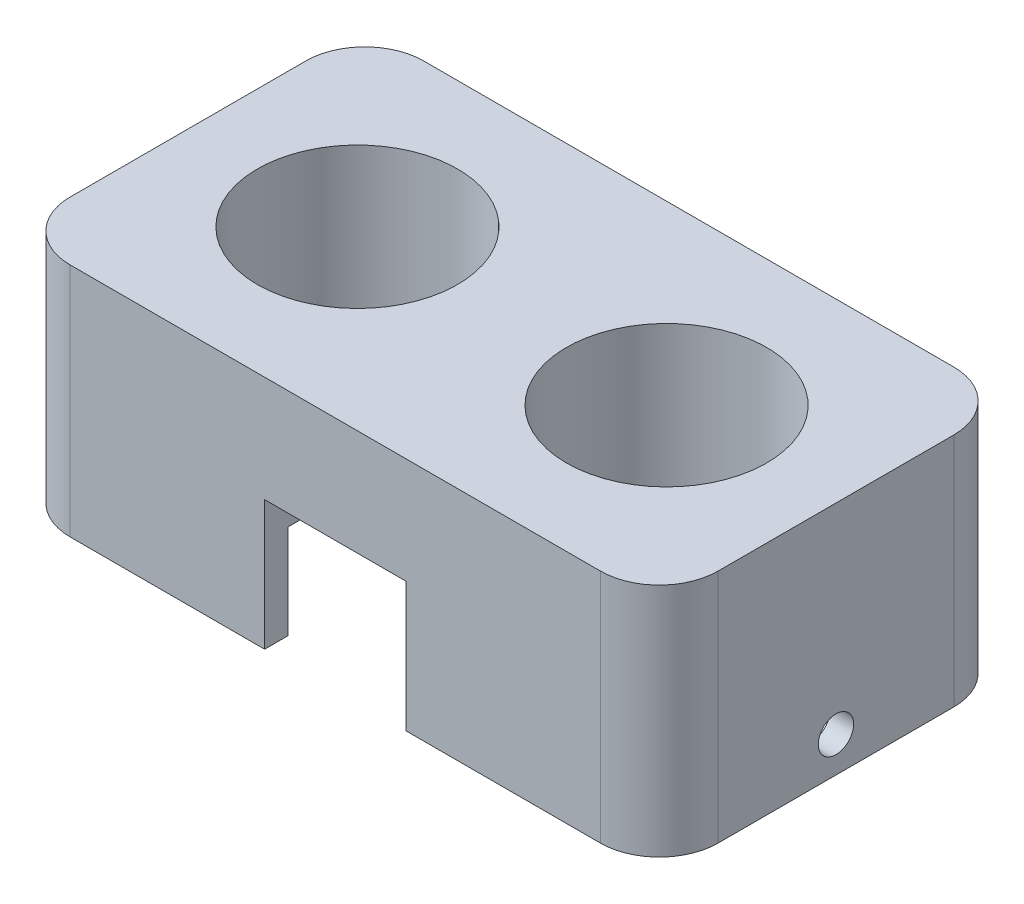
ISO-10303-21;
HEADER;
FILE_DESCRIPTION(('STEP AP214'),'2;1');
FILE_NAME('part.step','',(''),(''),'','','');
FILE_SCHEMA(('AUTOMOTIVE_DESIGN { 1 0 10303 214 1 1 1 1 }'));
ENDSEC;
DATA;
#1=APPLICATION_CONTEXT('core data for automotive mechanical design processes');
#2=APPLICATION_PROTOCOL_DEFINITION('international standard','automotive_design',2000,#1);
#3=PRODUCT_CONTEXT('',#1,'mechanical');
#4=PRODUCT('Part','Part','',(#3));
#5=PRODUCT_RELATED_PRODUCT_CATEGORY('part','',(#4));
#6=PRODUCT_DEFINITION_FORMATION('','',#4);
#7=PRODUCT_DEFINITION_CONTEXT('part definition',#1,'design');
#8=PRODUCT_DEFINITION('design','',#6,#7);
#9=PRODUCT_DEFINITION_SHAPE('','',#8);
#10=(LENGTH_UNIT() NAMED_UNIT(*) SI_UNIT(.MILLI.,.METRE.));
#11=(NAMED_UNIT(*) PLANE_ANGLE_UNIT() SI_UNIT($,.RADIAN.));
#12=(NAMED_UNIT(*) SI_UNIT($,.STERADIAN.) SOLID_ANGLE_UNIT());
#13=UNCERTAINTY_MEASURE_WITH_UNIT(LENGTH_MEASURE(1.E-05),#10,'distance_accuracy_value','');
#14=(GEOMETRIC_REPRESENTATION_CONTEXT(3) GLOBAL_UNCERTAINTY_ASSIGNED_CONTEXT((#13)) GLOBAL_UNIT_ASSIGNED_CONTEXT((#10,
#11,#12)) REPRESENTATION_CONTEXT('',''));
#15=CARTESIAN_POINT('',(0.,0.,0.));
#16=DIRECTION('',(0.,0.,1.));
#17=DIRECTION('',(1.,0.,0.));
#18=AXIS2_PLACEMENT_3D('',#15,#16,#17);
#19=CARTESIAN_POINT('',(0.,0.,0.));
#20=DIRECTION('',(0.,-1.,0.));
#21=DIRECTION('',(0.,0.,-1.));
#22=AXIS2_PLACEMENT_3D('',#19,#20,#21);
#23=PLANE('',#22);
#24=DIRECTION('',(0.,0.,-1.));
#25=VECTOR('',#24,1.);
#26=CARTESIAN_POINT('',(-6.,0.,-12.5));
#27=LINE('',#26,#25);
#28=CARTESIAN_POINT('',(-6.,0.,-9.5));
#29=VERTEX_POINT('',#28);
#30=CARTESIAN_POINT('',(-6.,0.,-10.5));
#31=VERTEX_POINT('',#30);
#32=EDGE_CURVE('E370',#29,#31,#27,.T.);
#33=ORIENTED_EDGE('',*,*,#32,.F.);
#34=CARTESIAN_POINT('',(-4.,0.,-9.5));
#35=DIRECTION('',(0.,-1.,0.));
#36=DIRECTION('',(0.,0.,-1.));
#37=AXIS2_PLACEMENT_3D('',#34,#35,#36);
#38=CIRCLE('',#37,2.);
#39=CARTESIAN_POINT('',(-4.,0.,-7.5));
#40=VERTEX_POINT('',#39);
#41=EDGE_CURVE('E453',#29,#40,#38,.F.);
#42=ORIENTED_EDGE('',*,*,#41,.T.);
#43=DIRECTION('',(-1.,0.,0.));
#44=VECTOR('',#43,1.);
#45=CARTESIAN_POINT('',(6.,0.,-7.5));
#46=LINE('',#45,#44);
#47=CARTESIAN_POINT('',(4.,0.,-7.5));
#48=VERTEX_POINT('',#47);
#49=EDGE_CURVE('E381',#48,#40,#46,.T.);
#50=ORIENTED_EDGE('',*,*,#49,.F.);
#51=CARTESIAN_POINT('',(4.,0.,-9.49999999999999));
#52=DIRECTION('',(0.,-1.,0.));
#53=DIRECTION('',(0.,0.,-1.));
#54=AXIS2_PLACEMENT_3D('',#51,#52,#53);
#55=CIRCLE('',#54,2.);
#56=CARTESIAN_POINT('',(6.,0.,-9.49999999999999));
#57=VERTEX_POINT('',#56);
#58=EDGE_CURVE('E451',#48,#57,#55,.F.);
#59=ORIENTED_EDGE('',*,*,#58,.T.);
#60=DIRECTION('',(0.,0.,1.));
#61=VECTOR('',#60,1.);
#62=CARTESIAN_POINT('',(6.,0.,-12.5));
#63=LINE('',#62,#61);
#64=CARTESIAN_POINT('',(6.,0.,-10.5));
#65=VERTEX_POINT('',#64);
#66=EDGE_CURVE('E396',#65,#57,#63,.T.);
#67=ORIENTED_EDGE('',*,*,#66,.F.);
#68=CARTESIAN_POINT('',(4.,0.,-10.5));
#69=DIRECTION('',(0.,-1.,0.));
#70=DIRECTION('',(0.,0.,-1.));
#71=AXIS2_PLACEMENT_3D('',#68,#69,#70);
#72=CIRCLE('',#71,2.);
#73=CARTESIAN_POINT('',(4.,0.,-12.5));
#74=VERTEX_POINT('',#73);
#75=EDGE_CURVE('E457',#65,#74,#72,.F.);
#76=ORIENTED_EDGE('',*,*,#75,.T.);
#77=DIRECTION('',(1.,0.,0.));
#78=VECTOR('',#77,1.);
#79=CARTESIAN_POINT('',(6.,0.,-12.5));
#80=LINE('',#79,#78);
#81=CARTESIAN_POINT('',(-4.,0.,-12.5));
#82=VERTEX_POINT('',#81);
#83=EDGE_CURVE('E393',#82,#74,#80,.T.);
#84=ORIENTED_EDGE('',*,*,#83,.F.);
#85=CARTESIAN_POINT('',(-4.,0.,-10.5));
#86=DIRECTION('',(0.,-1.,0.));
#87=DIRECTION('',(0.,0.,-1.));
#88=AXIS2_PLACEMENT_3D('',#85,#86,#87);
#89=CIRCLE('',#88,2.);
#90=EDGE_CURVE('E455',#82,#31,#89,.F.);
#91=ORIENTED_EDGE('',*,*,#90,.T.);
#92=EDGE_LOOP('',(#33,#42,#50,#59,#67,#76,#84,#91));
#93=FACE_BOUND('',#92,.T.);
#94=CARTESIAN_POINT('',(13.12,0.,0.));
#95=DIRECTION('',(0.,1.,0.));
#96=DIRECTION('',(0.,0.,1.));
#97=AXIS2_PLACEMENT_3D('',#94,#95,#96);
#98=CIRCLE('',#97,8.5);
#99=CARTESIAN_POINT('',(13.12,0.,8.5));
#100=VERTEX_POINT('',#99);
#101=EDGE_CURVE('E408',#100,#100,#98,.F.);
#102=ORIENTED_EDGE('',*,*,#101,.F.);
#103=EDGE_LOOP('',(#102));
#104=FACE_BOUND('',#103,.T.);
#105=CARTESIAN_POINT('',(-13.12,0.,0.));
#106=DIRECTION('',(0.,1.,0.));
#107=DIRECTION('',(0.,0.,1.));
#108=AXIS2_PLACEMENT_3D('',#105,#106,#107);
#109=CIRCLE('',#108,8.5);
#110=CARTESIAN_POINT('',(-13.12,0.,8.5));
#111=VERTEX_POINT('',#110);
#112=EDGE_CURVE('E401',#111,#111,#109,.T.);
#113=ORIENTED_EDGE('',*,*,#112,.T.);
#114=EDGE_LOOP('',(#113));
#115=FACE_BOUND('',#114,.T.);
#116=CARTESIAN_POINT('',(22.5,0.,10.));
#117=DIRECTION('',(0.,-1.,0.));
#118=DIRECTION('',(0.,0.,-1.));
#119=AXIS2_PLACEMENT_3D('',#116,#117,#118);
#120=CIRCLE('',#119,3.);
#121=CARTESIAN_POINT('',(25.5,0.,10.));
#122=VERTEX_POINT('',#121);
#123=CARTESIAN_POINT('',(22.5,0.,13.));
#124=VERTEX_POINT('',#123);
#125=EDGE_CURVE('E328',#122,#124,#120,.T.);
#126=ORIENTED_EDGE('',*,*,#125,.T.);
#127=DIRECTION('',(-1.,0.,0.));
#128=VECTOR('',#127,1.);
#129=CARTESIAN_POINT('',(0.,0.,13.));
#130=LINE('',#129,#128);
#131=CARTESIAN_POINT('',(6.,0.,13.));
#132=VERTEX_POINT('',#131);
#133=EDGE_CURVE('E325',#124,#132,#130,.T.);
#134=ORIENTED_EDGE('',*,*,#133,.T.);
#135=DIRECTION('',(0.,0.,1.));
#136=VECTOR('',#135,1.);
#137=CARTESIAN_POINT('',(6.,0.,10.));
#138=LINE('',#137,#136);
#139=CARTESIAN_POINT('',(6.,0.,10.));
#140=VERTEX_POINT('',#139);
#141=EDGE_CURVE('E240',#140,#132,#138,.T.);
#142=ORIENTED_EDGE('',*,*,#141,.F.);
#143=DIRECTION('',(1.,0.,0.));
#144=VECTOR('',#143,1.);
#145=CARTESIAN_POINT('',(-6.,0.,10.));
#146=LINE('',#145,#144);
#147=CARTESIAN_POINT('',(-6.,0.,10.));
#148=VERTEX_POINT('',#147);
#149=EDGE_CURVE('E352',#148,#140,#146,.T.);
#150=ORIENTED_EDGE('',*,*,#149,.F.);
#151=DIRECTION('',(0.,0.,-1.));
#152=VECTOR('',#151,1.);
#153=CARTESIAN_POINT('',(-6.,0.,10.));
#154=LINE('',#153,#152);
#155=CARTESIAN_POINT('',(-6.,0.,13.));
#156=VERTEX_POINT('',#155);
#157=EDGE_CURVE('E364',#156,#148,#154,.T.);
#158=ORIENTED_EDGE('',*,*,#157,.F.);
#159=DIRECTION('',(-1.,0.,0.));
#160=VECTOR('',#159,1.);
#161=CARTESIAN_POINT('',(0.,0.,13.));
#162=LINE('',#161,#160);
#163=CARTESIAN_POINT('',(-22.5,0.,13.));
#164=VERTEX_POINT('',#163);
#165=EDGE_CURVE('E322',#156,#164,#162,.T.);
#166=ORIENTED_EDGE('',*,*,#165,.T.);
#167=CARTESIAN_POINT('',(-22.5,0.,10.));
#168=DIRECTION('',(0.,-1.,0.));
#169=DIRECTION('',(0.,0.,-1.));
#170=AXIS2_PLACEMENT_3D('',#167,#168,#169);
#171=CIRCLE('',#170,3.);
#172=CARTESIAN_POINT('',(-25.5,0.,10.));
#173=VERTEX_POINT('',#172);
#174=EDGE_CURVE('E319',#164,#173,#171,.T.);
#175=ORIENTED_EDGE('',*,*,#174,.T.);
#176=DIRECTION('',(0.,0.,-1.));
#177=VECTOR('',#176,1.);
#178=CARTESIAN_POINT('',(-25.5,0.,0.));
#179=LINE('',#178,#177);
#180=CARTESIAN_POINT('',(-25.5,0.,-10.));
#181=VERTEX_POINT('',#180);
#182=EDGE_CURVE('E316',#173,#181,#179,.T.);
#183=ORIENTED_EDGE('',*,*,#182,.T.);
#184=CARTESIAN_POINT('',(-22.5,0.,-10.));
#185=DIRECTION('',(0.,-1.,0.));
#186=DIRECTION('',(0.,0.,-1.));
#187=AXIS2_PLACEMENT_3D('',#184,#185,#186);
#188=CIRCLE('',#187,3.);
#189=CARTESIAN_POINT('',(-22.5,0.,-13.));
#190=VERTEX_POINT('',#189);
#191=EDGE_CURVE('E313',#181,#190,#188,.T.);
#192=ORIENTED_EDGE('',*,*,#191,.T.);
#193=DIRECTION('',(1.,0.,0.));
#194=VECTOR('',#193,1.);
#195=CARTESIAN_POINT('',(0.,0.,-13.));
#196=LINE('',#195,#194);
#197=CARTESIAN_POINT('',(22.5,0.,-13.));
#198=VERTEX_POINT('',#197);
#199=EDGE_CURVE('E310',#190,#198,#196,.T.);
#200=ORIENTED_EDGE('',*,*,#199,.T.);
#201=CARTESIAN_POINT('',(22.5,0.,-10.));
#202=DIRECTION('',(0.,-1.,0.));
#203=DIRECTION('',(0.,0.,-1.));
#204=AXIS2_PLACEMENT_3D('',#201,#202,#203);
#205=CIRCLE('',#204,3.);
#206=CARTESIAN_POINT('',(25.5,0.,-10.));
#207=VERTEX_POINT('',#206);
#208=EDGE_CURVE('E51',#198,#207,#205,.T.);
#209=ORIENTED_EDGE('',*,*,#208,.T.);
#210=DIRECTION('',(0.,0.,1.));
#211=VECTOR('',#210,1.);
#212=CARTESIAN_POINT('',(25.5,0.,0.));
#213=LINE('',#212,#211);
#214=EDGE_CURVE('E252',#207,#122,#213,.T.);
#215=ORIENTED_EDGE('',*,*,#214,.T.);
#216=EDGE_LOOP('',(#126,#134,#142,#150,#158,#166,#175,#183,#192,#200,#209,#215));
#217=FACE_BOUND('',#216,.T.);
#218=ADVANCED_FACE('F35',(#93,#104,#115,#217),#23,.T.);
#219=CARTESIAN_POINT('',(0.,12.,0.));
#220=DIRECTION('',(0.,-1.,0.));
#221=DIRECTION('',(0.,0.,-1.));
#222=AXIS2_PLACEMENT_3D('',#219,#220,#221);
#223=PLANE('',#222);
#224=DIRECTION('',(1.,0.,0.));
#225=VECTOR('',#224,1.);
#226=CARTESIAN_POINT('',(-27.5,12.,15.));
#227=LINE('',#226,#225);
#228=CARTESIAN_POINT('',(-22.5,12.,15.));
#229=VERTEX_POINT('',#228);
#230=CARTESIAN_POINT('',(22.5,12.,15.));
#231=VERTEX_POINT('',#230);
#232=EDGE_CURVE('E420',#229,#231,#227,.T.);
#233=ORIENTED_EDGE('',*,*,#232,.T.);
#234=CARTESIAN_POINT('',(22.5,12.,10.));
#235=DIRECTION('',(0.,-1.,0.));
#236=DIRECTION('',(0.,0.,-1.));
#237=AXIS2_PLACEMENT_3D('',#234,#235,#236);
#238=CIRCLE('',#237,5.);
#239=CARTESIAN_POINT('',(27.5,12.,10.));
#240=VERTEX_POINT('',#239);
#241=EDGE_CURVE('E473',#231,#240,#238,.F.);
#242=ORIENTED_EDGE('',*,*,#241,.T.);
#243=DIRECTION('',(0.,0.,-1.));
#244=VECTOR('',#243,1.);
#245=CARTESIAN_POINT('',(27.5,12.,15.));
#246=LINE('',#245,#244);
#247=CARTESIAN_POINT('',(27.5,12.,-10.));
#248=VERTEX_POINT('',#247);
#249=EDGE_CURVE('E404',#240,#248,#246,.T.);
#250=ORIENTED_EDGE('',*,*,#249,.T.);
#251=CARTESIAN_POINT('',(22.5,12.,-10.));
#252=DIRECTION('',(0.,-1.,0.));
#253=DIRECTION('',(0.,0.,-1.));
#254=AXIS2_PLACEMENT_3D('',#251,#252,#253);
#255=CIRCLE('',#254,5.);
#256=CARTESIAN_POINT('',(22.5,12.,-15.));
#257=VERTEX_POINT('',#256);
#258=EDGE_CURVE('E469',#248,#257,#255,.F.);
#259=ORIENTED_EDGE('',*,*,#258,.T.);
#260=DIRECTION('',(-1.,0.,0.));
#261=VECTOR('',#260,1.);
#262=CARTESIAN_POINT('',(-27.5,12.,-15.));
#263=LINE('',#262,#261);
#264=CARTESIAN_POINT('',(-22.5,12.,-15.));
#265=VERTEX_POINT('',#264);
#266=EDGE_CURVE('E415',#257,#265,#263,.T.);
#267=ORIENTED_EDGE('',*,*,#266,.T.);
#268=CARTESIAN_POINT('',(-22.5,12.,-10.));
#269=DIRECTION('',(0.,-1.,0.));
#270=DIRECTION('',(0.,0.,-1.));
#271=AXIS2_PLACEMENT_3D('',#268,#269,#270);
#272=CIRCLE('',#271,5.);
#273=CARTESIAN_POINT('',(-27.5,12.,-10.));
#274=VERTEX_POINT('',#273);
#275=EDGE_CURVE('E471',#265,#274,#272,.F.);
#276=ORIENTED_EDGE('',*,*,#275,.T.);
#277=DIRECTION('',(0.,0.,1.));
#278=VECTOR('',#277,1.);
#279=CARTESIAN_POINT('',(-27.5,12.,15.));
#280=LINE('',#279,#278);
#281=CARTESIAN_POINT('',(-27.5,12.,10.));
#282=VERTEX_POINT('',#281);
#283=EDGE_CURVE('E418',#274,#282,#280,.T.);
#284=ORIENTED_EDGE('',*,*,#283,.T.);
#285=CARTESIAN_POINT('',(-22.5,12.,10.));
#286=DIRECTION('',(0.,-1.,0.));
#287=DIRECTION('',(0.,0.,-1.));
#288=AXIS2_PLACEMENT_3D('',#285,#286,#287);
#289=CIRCLE('',#288,5.);
#290=EDGE_CURVE('E467',#282,#229,#289,.F.);
#291=ORIENTED_EDGE('',*,*,#290,.T.);
#292=EDGE_LOOP('',(#233,#242,#250,#259,#267,#276,#284,#291));
#293=FACE_BOUND('',#292,.T.);
#294=CARTESIAN_POINT('',(13.12,12.,0.));
#295=DIRECTION('',(0.,1.,0.));
#296=DIRECTION('',(0.,0.,1.));
#297=AXIS2_PLACEMENT_3D('',#294,#295,#296);
#298=CIRCLE('',#297,8.5);
#299=CARTESIAN_POINT('',(13.12,12.,8.5));
#300=VERTEX_POINT('',#299);
#301=EDGE_CURVE('E390',#300,#300,#298,.F.);
#302=ORIENTED_EDGE('',*,*,#301,.T.);
#303=EDGE_LOOP('',(#302));
#304=FACE_BOUND('',#303,.T.);
#305=CARTESIAN_POINT('',(-13.12,12.,0.));
#306=DIRECTION('',(0.,1.,0.));
#307=DIRECTION('',(0.,0.,1.));
#308=AXIS2_PLACEMENT_3D('',#305,#306,#307);
#309=CIRCLE('',#308,8.5);
#310=CARTESIAN_POINT('',(-13.12,12.,8.5));
#311=VERTEX_POINT('',#310);
#312=EDGE_CURVE('E405',#311,#311,#309,.T.);
#313=ORIENTED_EDGE('',*,*,#312,.F.);
#314=EDGE_LOOP('',(#313));
#315=FACE_BOUND('',#314,.T.);
#316=ADVANCED_FACE('F494',(#293,#304,#315),#223,.F.);
#317=CARTESIAN_POINT('',(27.5,12.,15.));
#318=DIRECTION('',(-1.,0.,0.));
#319=DIRECTION('',(0.,0.,1.));
#320=AXIS2_PLACEMENT_3D('',#317,#318,#319);
#321=PLANE('',#320);
#322=CARTESIAN_POINT('',(27.5,-5.,0.));
#323=DIRECTION('',(-1.,0.,0.));
#324=DIRECTION('',(0.,0.,1.));
#325=AXIS2_PLACEMENT_3D('',#322,#323,#324);
#326=CIRCLE('',#325,1.49999999999999);
#327=CARTESIAN_POINT('',(27.5,-5.,1.49999999999999));
#328=VERTEX_POINT('',#327);
#329=EDGE_CURVE('E925',#328,#328,#326,.T.);
#330=ORIENTED_EDGE('',*,*,#329,.T.);
#331=EDGE_LOOP('',(#330));
#332=FACE_BOUND('',#331,.T.);
#333=ORIENTED_EDGE('',*,*,#249,.F.);
#334=DIRECTION('',(0.,-1.,0.));
#335=VECTOR('',#334,1.);
#336=CARTESIAN_POINT('',(27.5,12.,10.));
#337=LINE('',#336,#335);
#338=CARTESIAN_POINT('',(27.5,-8.,10.));
#339=VERTEX_POINT('',#338);
#340=EDGE_CURVE('E461',#240,#339,#337,.T.);
#341=ORIENTED_EDGE('',*,*,#340,.T.);
#342=DIRECTION('',(0.,0.,1.));
#343=VECTOR('',#342,1.);
#344=CARTESIAN_POINT('',(27.5,-8.,0.));
#345=LINE('',#344,#343);
#346=CARTESIAN_POINT('',(27.5,-8.,-10.));
#347=VERTEX_POINT('',#346);
#348=EDGE_CURVE('E290',#347,#339,#345,.T.);
#349=ORIENTED_EDGE('',*,*,#348,.F.);
#350=DIRECTION('',(0.,-1.,0.));
#351=VECTOR('',#350,1.);
#352=CARTESIAN_POINT('',(27.5,12.,-10.));
#353=LINE('',#352,#351);
#354=EDGE_CURVE('E459',#347,#248,#353,.F.);
#355=ORIENTED_EDGE('',*,*,#354,.T.);
#356=EDGE_LOOP('',(#333,#341,#349,#355));
#357=FACE_BOUND('',#356,.T.);
#358=ADVANCED_FACE('F491',(#332,#357),#321,.F.);
#359=CARTESIAN_POINT('',(-27.5,12.,-15.));
#360=DIRECTION('',(0.,0.,1.));
#361=DIRECTION('',(1.,0.,0.));
#362=AXIS2_PLACEMENT_3D('',#359,#360,#361);
#363=PLANE('',#362);
#364=DIRECTION('',(0.,-1.,0.));
#365=VECTOR('',#364,1.);
#366=CARTESIAN_POINT('',(22.5,12.,-15.));
#367=LINE('',#366,#365);
#368=CARTESIAN_POINT('',(22.5,-8.,-15.));
#369=VERTEX_POINT('',#368);
#370=EDGE_CURVE('E44',#257,#369,#367,.T.);
#371=ORIENTED_EDGE('',*,*,#370,.T.);
#372=DIRECTION('',(1.,0.,0.));
#373=VECTOR('',#372,1.);
#374=CARTESIAN_POINT('',(0.,-8.,-15.));
#375=LINE('',#374,#373);
#376=CARTESIAN_POINT('',(-22.5,-8.,-15.));
#377=VERTEX_POINT('',#376);
#378=EDGE_CURVE('E284',#377,#369,#375,.T.);
#379=ORIENTED_EDGE('',*,*,#378,.F.);
#380=DIRECTION('',(0.,-1.,0.));
#381=VECTOR('',#380,1.);
#382=CARTESIAN_POINT('',(-22.5,12.,-15.));
#383=LINE('',#382,#381);
#384=EDGE_CURVE('E11',#377,#265,#383,.F.);
#385=ORIENTED_EDGE('',*,*,#384,.T.);
#386=ORIENTED_EDGE('',*,*,#266,.F.);
#387=EDGE_LOOP('',(#371,#379,#385,#386));
#388=FACE_BOUND('',#387,.T.);
#389=ADVANCED_FACE('F482',(#388),#363,.F.);
#390=CARTESIAN_POINT('',(-27.5,12.,15.));
#391=DIRECTION('',(1.,0.,0.));
#392=DIRECTION('',(0.,0.,-1.));
#393=AXIS2_PLACEMENT_3D('',#390,#391,#392);
#394=PLANE('',#393);
#395=CARTESIAN_POINT('',(-27.5,-5.,0.));
#396=DIRECTION('',(-1.,0.,0.));
#397=DIRECTION('',(0.,0.,1.));
#398=AXIS2_PLACEMENT_3D('',#395,#396,#397);
#399=CIRCLE('',#398,1.49999999999999);
#400=CARTESIAN_POINT('',(-27.5,-5.,1.49999999999999));
#401=VERTEX_POINT('',#400);
#402=EDGE_CURVE('E924',#401,#401,#399,.T.);
#403=ORIENTED_EDGE('',*,*,#402,.F.);
#404=EDGE_LOOP('',(#403));
#405=FACE_BOUND('',#404,.T.);
#406=ORIENTED_EDGE('',*,*,#283,.F.);
#407=DIRECTION('',(0.,-1.,0.));
#408=VECTOR('',#407,1.);
#409=CARTESIAN_POINT('',(-27.5,12.,-10.));
#410=LINE('',#409,#408);
#411=CARTESIAN_POINT('',(-27.5,-8.,-10.));
#412=VERTEX_POINT('',#411);
#413=EDGE_CURVE('E476',#274,#412,#410,.T.);
#414=ORIENTED_EDGE('',*,*,#413,.T.);
#415=DIRECTION('',(0.,0.,-1.));
#416=VECTOR('',#415,1.);
#417=CARTESIAN_POINT('',(-27.5,-8.,0.));
#418=LINE('',#417,#416);
#419=CARTESIAN_POINT('',(-27.5,-8.,10.));
#420=VERTEX_POINT('',#419);
#421=EDGE_CURVE('E278',#420,#412,#418,.T.);
#422=ORIENTED_EDGE('',*,*,#421,.F.);
#423=DIRECTION('',(0.,-1.,0.));
#424=VECTOR('',#423,1.);
#425=CARTESIAN_POINT('',(-27.5,12.,10.));
#426=LINE('',#425,#424);
#427=EDGE_CURVE('E59',#420,#282,#426,.F.);
#428=ORIENTED_EDGE('',*,*,#427,.T.);
#429=EDGE_LOOP('',(#406,#414,#422,#428));
#430=FACE_BOUND('',#429,.T.);
#431=ADVANCED_FACE('F546',(#405,#430),#394,.F.);
#432=CARTESIAN_POINT('',(-27.5,12.,15.));
#433=DIRECTION('',(0.,0.,-1.));
#434=DIRECTION('',(-1.,0.,0.));
#435=AXIS2_PLACEMENT_3D('',#432,#433,#434);
#436=PLANE('',#435);
#437=DIRECTION('',(0.,-1.,0.));
#438=VECTOR('',#437,1.);
#439=CARTESIAN_POINT('',(6.,3.,15.));
#440=LINE('',#439,#438);
#441=CARTESIAN_POINT('',(6.,3.,15.));
#442=VERTEX_POINT('',#441);
#443=CARTESIAN_POINT('',(6.,-8.,15.));
#444=VERTEX_POINT('',#443);
#445=EDGE_CURVE('E361',#442,#444,#440,.T.);
#446=ORIENTED_EDGE('',*,*,#445,.T.);
#447=DIRECTION('',(-1.,0.,0.));
#448=VECTOR('',#447,1.);
#449=CARTESIAN_POINT('',(0.,-8.,15.));
#450=LINE('',#449,#448);
#451=CARTESIAN_POINT('',(22.5,-8.,15.));
#452=VERTEX_POINT('',#451);
#453=EDGE_CURVE('E296',#452,#444,#450,.T.);
#454=ORIENTED_EDGE('',*,*,#453,.F.);
#455=DIRECTION('',(0.,-1.,0.));
#456=VECTOR('',#455,1.);
#457=CARTESIAN_POINT('',(22.5,12.,15.));
#458=LINE('',#457,#456);
#459=EDGE_CURVE('E465',#452,#231,#458,.F.);
#460=ORIENTED_EDGE('',*,*,#459,.T.);
#461=ORIENTED_EDGE('',*,*,#232,.F.);
#462=DIRECTION('',(0.,-1.,0.));
#463=VECTOR('',#462,1.);
#464=CARTESIAN_POINT('',(-22.5,12.,15.));
#465=LINE('',#464,#463);
#466=CARTESIAN_POINT('',(-22.5,-8.,15.));
#467=VERTEX_POINT('',#466);
#468=EDGE_CURVE('E463',#229,#467,#465,.T.);
#469=ORIENTED_EDGE('',*,*,#468,.T.);
#470=DIRECTION('',(-1.,0.,0.));
#471=VECTOR('',#470,1.);
#472=CARTESIAN_POINT('',(0.,-8.,15.));
#473=LINE('',#472,#471);
#474=CARTESIAN_POINT('',(-6.,-8.,15.));
#475=VERTEX_POINT('',#474);
#476=EDGE_CURVE('E272',#475,#467,#473,.T.);
#477=ORIENTED_EDGE('',*,*,#476,.F.);
#478=DIRECTION('',(0.,-1.,0.));
#479=VECTOR('',#478,1.);
#480=CARTESIAN_POINT('',(-6.,3.,15.));
#481=LINE('',#480,#479);
#482=CARTESIAN_POINT('',(-6.,3.,15.));
#483=VERTEX_POINT('',#482);
#484=EDGE_CURVE('E374',#483,#475,#481,.T.);
#485=ORIENTED_EDGE('',*,*,#484,.F.);
#486=DIRECTION('',(-1.,0.,0.));
#487=VECTOR('',#486,1.);
#488=CARTESIAN_POINT('',(-6.,3.,15.));
#489=LINE('',#488,#487);
#490=EDGE_CURVE('E351',#442,#483,#489,.T.);
#491=ORIENTED_EDGE('',*,*,#490,.F.);
#492=EDGE_LOOP('',(#446,#454,#460,#461,#469,#477,#485,#491));
#493=FACE_BOUND('',#492,.T.);
#494=ADVANCED_FACE('F504',(#493),#436,.F.);
#495=CARTESIAN_POINT('',(13.12,0.,0.));
#496=DIRECTION('',(0.,1.,0.));
#497=DIRECTION('',(0.,0.,1.));
#498=AXIS2_PLACEMENT_3D('',#495,#496,#497);
#499=CYLINDRICAL_SURFACE('',#498,8.5);
#500=ORIENTED_EDGE('',*,*,#101,.T.);
#501=EDGE_LOOP('',(#500));
#502=FACE_BOUND('',#501,.T.);
#503=ORIENTED_EDGE('',*,*,#301,.F.);
#504=EDGE_LOOP('',(#503));
#505=FACE_BOUND('',#504,.T.);
#506=ADVANCED_FACE('F572',(#502,#505),#499,.F.);
#507=CARTESIAN_POINT('',(-13.12,0.,0.));
#508=DIRECTION('',(0.,1.,0.));
#509=DIRECTION('',(0.,0.,1.));
#510=AXIS2_PLACEMENT_3D('',#507,#508,#509);
#511=CYLINDRICAL_SURFACE('',#510,8.5);
#512=ORIENTED_EDGE('',*,*,#112,.F.);
#513=EDGE_LOOP('',(#512));
#514=FACE_BOUND('',#513,.T.);
#515=ORIENTED_EDGE('',*,*,#312,.T.);
#516=EDGE_LOOP('',(#515));
#517=FACE_BOUND('',#516,.T.);
#518=ADVANCED_FACE('F642',(#514,#517),#511,.F.);
#519=CARTESIAN_POINT('',(-6.,5.,-12.5));
#520=DIRECTION('',(-1.,0.,0.));
#521=DIRECTION('',(0.,0.,1.));
#522=AXIS2_PLACEMENT_3D('',#519,#520,#521);
#523=PLANE('',#522);
#524=DIRECTION('',(0.,0.,-1.));
#525=VECTOR('',#524,1.);
#526=CARTESIAN_POINT('',(-6.,5.,-12.5));
#527=LINE('',#526,#525);
#528=CARTESIAN_POINT('',(-6.,5.,-9.5));
#529=VERTEX_POINT('',#528);
#530=CARTESIAN_POINT('',(-6.,5.,-10.5));
#531=VERTEX_POINT('',#530);
#532=EDGE_CURVE('E377',#529,#531,#527,.T.);
#533=ORIENTED_EDGE('',*,*,#532,.F.);
#534=DIRECTION('',(0.,-1.,0.));
#535=VECTOR('',#534,1.);
#536=CARTESIAN_POINT('',(-6.,0.,-9.5));
#537=LINE('',#536,#535);
#538=EDGE_CURVE('E443',#529,#29,#537,.T.);
#539=ORIENTED_EDGE('',*,*,#538,.T.);
#540=ORIENTED_EDGE('',*,*,#32,.T.);
#541=DIRECTION('',(0.,-1.,0.));
#542=VECTOR('',#541,1.);
#543=CARTESIAN_POINT('',(-6.,5.,-10.5));
#544=LINE('',#543,#542);
#545=EDGE_CURVE('E441',#31,#531,#544,.F.);
#546=ORIENTED_EDGE('',*,*,#545,.T.);
#547=EDGE_LOOP('',(#533,#539,#540,#546));
#548=FACE_BOUND('',#547,.T.);
#549=ADVANCED_FACE('F624',(#548),#523,.F.);
#550=CARTESIAN_POINT('',(6.,5.,-7.5));
#551=DIRECTION('',(0.,0.,1.));
#552=DIRECTION('',(1.,0.,0.));
#553=AXIS2_PLACEMENT_3D('',#550,#551,#552);
#554=PLANE('',#553);
#555=DIRECTION('',(-1.,0.,0.));
#556=VECTOR('',#555,1.);
#557=CARTESIAN_POINT('',(6.,5.,-7.5));
#558=LINE('',#557,#556);
#559=CARTESIAN_POINT('',(4.,5.,-7.5));
#560=VERTEX_POINT('',#559);
#561=CARTESIAN_POINT('',(-4.,5.,-7.5));
#562=VERTEX_POINT('',#561);
#563=EDGE_CURVE('E387',#560,#562,#558,.T.);
#564=ORIENTED_EDGE('',*,*,#563,.F.);
#565=DIRECTION('',(0.,-1.,0.));
#566=VECTOR('',#565,1.);
#567=CARTESIAN_POINT('',(4.,0.,-7.5));
#568=LINE('',#567,#566);
#569=EDGE_CURVE('E425',#560,#48,#568,.T.);
#570=ORIENTED_EDGE('',*,*,#569,.T.);
#571=ORIENTED_EDGE('',*,*,#49,.T.);
#572=DIRECTION('',(0.,-1.,0.));
#573=VECTOR('',#572,1.);
#574=CARTESIAN_POINT('',(-4.,5.,-7.5));
#575=LINE('',#574,#573);
#576=EDGE_CURVE('E423',#40,#562,#575,.F.);
#577=ORIENTED_EDGE('',*,*,#576,.T.);
#578=EDGE_LOOP('',(#564,#570,#571,#577));
#579=FACE_BOUND('',#578,.T.);
#580=ADVANCED_FACE('F617',(#579),#554,.F.);
#581=CARTESIAN_POINT('',(6.,5.,-12.5));
#582=DIRECTION('',(1.,0.,0.));
#583=DIRECTION('',(0.,0.,-1.));
#584=AXIS2_PLACEMENT_3D('',#581,#582,#583);
#585=PLANE('',#584);
#586=ORIENTED_EDGE('',*,*,#66,.T.);
#587=DIRECTION('',(0.,-1.,0.));
#588=VECTOR('',#587,1.);
#589=CARTESIAN_POINT('',(6.,5.,-9.49999999999999));
#590=LINE('',#589,#588);
#591=CARTESIAN_POINT('',(6.,5.,-9.49999999999999));
#592=VERTEX_POINT('',#591);
#593=EDGE_CURVE('E431',#57,#592,#590,.F.);
#594=ORIENTED_EDGE('',*,*,#593,.T.);
#595=DIRECTION('',(0.,0.,1.));
#596=VECTOR('',#595,1.);
#597=CARTESIAN_POINT('',(6.,5.,-12.5));
#598=LINE('',#597,#596);
#599=CARTESIAN_POINT('',(6.,5.,-10.5));
#600=VERTEX_POINT('',#599);
#601=EDGE_CURVE('E384',#600,#592,#598,.T.);
#602=ORIENTED_EDGE('',*,*,#601,.F.);
#603=DIRECTION('',(0.,-1.,0.));
#604=VECTOR('',#603,1.);
#605=CARTESIAN_POINT('',(6.,0.,-10.5));
#606=LINE('',#605,#604);
#607=EDGE_CURVE('E428',#600,#65,#606,.T.);
#608=ORIENTED_EDGE('',*,*,#607,.T.);
#609=EDGE_LOOP('',(#586,#594,#602,#608));
#610=FACE_BOUND('',#609,.T.);
#611=ADVANCED_FACE('F610',(#610),#585,.F.);
#612=CARTESIAN_POINT('',(6.,5.,-12.5));
#613=DIRECTION('',(0.,0.,-1.));
#614=DIRECTION('',(-1.,0.,0.));
#615=AXIS2_PLACEMENT_3D('',#612,#613,#614);
#616=PLANE('',#615);
#617=DIRECTION('',(1.,0.,0.));
#618=VECTOR('',#617,1.);
#619=CARTESIAN_POINT('',(6.,5.,-12.5));
#620=LINE('',#619,#618);
#621=CARTESIAN_POINT('',(-4.,5.,-12.5));
#622=VERTEX_POINT('',#621);
#623=CARTESIAN_POINT('',(4.,5.,-12.5));
#624=VERTEX_POINT('',#623);
#625=EDGE_CURVE('E380',#622,#624,#620,.T.);
#626=ORIENTED_EDGE('',*,*,#625,.F.);
#627=DIRECTION('',(0.,-1.,0.));
#628=VECTOR('',#627,1.);
#629=CARTESIAN_POINT('',(-4.,0.,-12.5));
#630=LINE('',#629,#628);
#631=EDGE_CURVE('E448',#622,#82,#630,.T.);
#632=ORIENTED_EDGE('',*,*,#631,.T.);
#633=ORIENTED_EDGE('',*,*,#83,.T.);
#634=DIRECTION('',(0.,-1.,0.));
#635=VECTOR('',#634,1.);
#636=CARTESIAN_POINT('',(4.,5.,-12.5));
#637=LINE('',#636,#635);
#638=EDGE_CURVE('E446',#74,#624,#637,.F.);
#639=ORIENTED_EDGE('',*,*,#638,.T.);
#640=EDGE_LOOP('',(#626,#632,#633,#639));
#641=FACE_BOUND('',#640,.T.);
#642=ADVANCED_FACE('F628',(#641),#616,.F.);
#643=CARTESIAN_POINT('',(0.,5.,0.));
#644=DIRECTION('',(0.,-1.,0.));
#645=DIRECTION('',(0.,0.,-1.));
#646=AXIS2_PLACEMENT_3D('',#643,#644,#645);
#647=PLANE('',#646);
#648=ORIENTED_EDGE('',*,*,#601,.T.);
#649=CARTESIAN_POINT('',(4.,5.,-9.49999999999999));
#650=DIRECTION('',(0.,-1.,0.));
#651=DIRECTION('',(0.,0.,-1.));
#652=AXIS2_PLACEMENT_3D('',#649,#650,#651);
#653=CIRCLE('',#652,2.);
#654=EDGE_CURVE('E439',#592,#560,#653,.T.);
#655=ORIENTED_EDGE('',*,*,#654,.T.);
#656=ORIENTED_EDGE('',*,*,#563,.T.);
#657=CARTESIAN_POINT('',(-4.,5.,-9.5));
#658=DIRECTION('',(0.,-1.,0.));
#659=DIRECTION('',(0.,0.,-1.));
#660=AXIS2_PLACEMENT_3D('',#657,#658,#659);
#661=CIRCLE('',#660,2.);
#662=EDGE_CURVE('E437',#562,#529,#661,.T.);
#663=ORIENTED_EDGE('',*,*,#662,.T.);
#664=ORIENTED_EDGE('',*,*,#532,.T.);
#665=CARTESIAN_POINT('',(-4.,5.,-10.5));
#666=DIRECTION('',(0.,-1.,0.));
#667=DIRECTION('',(0.,0.,-1.));
#668=AXIS2_PLACEMENT_3D('',#665,#666,#667);
#669=CIRCLE('',#668,2.);
#670=EDGE_CURVE('E435',#531,#622,#669,.T.);
#671=ORIENTED_EDGE('',*,*,#670,.T.);
#672=ORIENTED_EDGE('',*,*,#625,.T.);
#673=CARTESIAN_POINT('',(4.,5.,-10.5));
#674=DIRECTION('',(0.,-1.,0.));
#675=DIRECTION('',(0.,0.,-1.));
#676=AXIS2_PLACEMENT_3D('',#673,#674,#675);
#677=CIRCLE('',#676,2.);
#678=EDGE_CURVE('E433',#624,#600,#677,.T.);
#679=ORIENTED_EDGE('',*,*,#678,.T.);
#680=EDGE_LOOP('',(#648,#655,#656,#663,#664,#671,#672,#679));
#681=FACE_BOUND('',#680,.T.);
#682=ADVANCED_FACE('F585',(#681),#647,.T.);
#683=CARTESIAN_POINT('',(4.,5.,-9.49999999999999));
#684=DIRECTION('',(0.,1.,0.));
#685=DIRECTION('',(0.,0.,1.));
#686=AXIS2_PLACEMENT_3D('',#683,#684,#685);
#687=CYLINDRICAL_SURFACE('',#686,2.);
#688=ORIENTED_EDGE('',*,*,#654,.F.);
#689=ORIENTED_EDGE('',*,*,#593,.F.);
#690=ORIENTED_EDGE('',*,*,#58,.F.);
#691=ORIENTED_EDGE('',*,*,#569,.F.);
#692=EDGE_LOOP('',(#688,#689,#690,#691));
#693=FACE_BOUND('',#692,.T.);
#694=ADVANCED_FACE('F581',(#693),#687,.F.);
#695=CARTESIAN_POINT('',(-4.,5.,-9.5));
#696=DIRECTION('',(0.,1.,0.));
#697=DIRECTION('',(0.,0.,1.));
#698=AXIS2_PLACEMENT_3D('',#695,#696,#697);
#699=CYLINDRICAL_SURFACE('',#698,2.);
#700=ORIENTED_EDGE('',*,*,#662,.F.);
#701=ORIENTED_EDGE('',*,*,#576,.F.);
#702=ORIENTED_EDGE('',*,*,#41,.F.);
#703=ORIENTED_EDGE('',*,*,#538,.F.);
#704=EDGE_LOOP('',(#700,#701,#702,#703));
#705=FACE_BOUND('',#704,.T.);
#706=ADVANCED_FACE('F584',(#705),#699,.F.);
#707=CARTESIAN_POINT('',(-4.,5.,-10.5));
#708=DIRECTION('',(0.,1.,0.));
#709=DIRECTION('',(0.,0.,1.));
#710=AXIS2_PLACEMENT_3D('',#707,#708,#709);
#711=CYLINDRICAL_SURFACE('',#710,2.);
#712=ORIENTED_EDGE('',*,*,#670,.F.);
#713=ORIENTED_EDGE('',*,*,#545,.F.);
#714=ORIENTED_EDGE('',*,*,#90,.F.);
#715=ORIENTED_EDGE('',*,*,#631,.F.);
#716=EDGE_LOOP('',(#712,#713,#714,#715));
#717=FACE_BOUND('',#716,.T.);
#718=ADVANCED_FACE('F589',(#717),#711,.F.);
#719=CARTESIAN_POINT('',(4.,5.,-10.5));
#720=DIRECTION('',(0.,1.,0.));
#721=DIRECTION('',(0.,0.,1.));
#722=AXIS2_PLACEMENT_3D('',#719,#720,#721);
#723=CYLINDRICAL_SURFACE('',#722,2.);
#724=ORIENTED_EDGE('',*,*,#678,.F.);
#725=ORIENTED_EDGE('',*,*,#638,.F.);
#726=ORIENTED_EDGE('',*,*,#75,.F.);
#727=ORIENTED_EDGE('',*,*,#607,.F.);
#728=EDGE_LOOP('',(#724,#725,#726,#727));
#729=FACE_BOUND('',#728,.T.);
#730=ADVANCED_FACE('F593',(#729),#723,.F.);
#731=CARTESIAN_POINT('',(6.,3.,10.));
#732=DIRECTION('',(1.,0.,0.));
#733=DIRECTION('',(0.,0.,-1.));
#734=AXIS2_PLACEMENT_3D('',#731,#732,#733);
#735=PLANE('',#734);
#736=ORIENTED_EDGE('',*,*,#141,.T.);
#737=DIRECTION('',(0.,1.,0.));
#738=VECTOR('',#737,1.);
#739=CARTESIAN_POINT('',(6.,-8.,13.));
#740=LINE('',#739,#738);
#741=CARTESIAN_POINT('',(6.,-8.,13.));
#742=VERTEX_POINT('',#741);
#743=EDGE_CURVE('E338',#742,#132,#740,.T.);
#744=ORIENTED_EDGE('',*,*,#743,.F.);
#745=DIRECTION('',(0.,0.,-1.));
#746=VECTOR('',#745,1.);
#747=CARTESIAN_POINT('',(6.,-8.,0.));
#748=LINE('',#747,#746);
#749=EDGE_CURVE('E299',#444,#742,#748,.T.);
#750=ORIENTED_EDGE('',*,*,#749,.F.);
#751=ORIENTED_EDGE('',*,*,#445,.F.);
#752=DIRECTION('',(0.,0.,1.));
#753=VECTOR('',#752,1.);
#754=CARTESIAN_POINT('',(6.,3.,10.));
#755=LINE('',#754,#753);
#756=CARTESIAN_POINT('',(6.,3.,10.));
#757=VERTEX_POINT('',#756);
#758=EDGE_CURVE('E349',#757,#442,#755,.T.);
#759=ORIENTED_EDGE('',*,*,#758,.F.);
#760=DIRECTION('',(0.,-1.,0.));
#761=VECTOR('',#760,1.);
#762=CARTESIAN_POINT('',(6.,3.,10.));
#763=LINE('',#762,#761);
#764=EDGE_CURVE('E368',#757,#140,#763,.T.);
#765=ORIENTED_EDGE('',*,*,#764,.T.);
#766=EDGE_LOOP('',(#736,#744,#750,#751,#759,#765));
#767=FACE_BOUND('',#766,.T.);
#768=ADVANCED_FACE('F510',(#767),#735,.F.);
#769=CARTESIAN_POINT('',(-6.,3.,10.));
#770=DIRECTION('',(0.,0.,-1.));
#771=DIRECTION('',(-1.,0.,0.));
#772=AXIS2_PLACEMENT_3D('',#769,#770,#771);
#773=PLANE('',#772);
#774=ORIENTED_EDGE('',*,*,#149,.T.);
#775=ORIENTED_EDGE('',*,*,#764,.F.);
#776=DIRECTION('',(1.,0.,0.));
#777=VECTOR('',#776,1.);
#778=CARTESIAN_POINT('',(-6.,3.,10.));
#779=LINE('',#778,#777);
#780=CARTESIAN_POINT('',(-6.,3.,10.));
#781=VERTEX_POINT('',#780);
#782=EDGE_CURVE('E358',#781,#757,#779,.T.);
#783=ORIENTED_EDGE('',*,*,#782,.F.);
#784=DIRECTION('',(0.,-1.,0.));
#785=VECTOR('',#784,1.);
#786=CARTESIAN_POINT('',(-6.,3.,10.));
#787=LINE('',#786,#785);
#788=EDGE_CURVE('E371',#781,#148,#787,.T.);
#789=ORIENTED_EDGE('',*,*,#788,.T.);
#790=EDGE_LOOP('',(#774,#775,#783,#789));
#791=FACE_BOUND('',#790,.T.);
#792=ADVANCED_FACE('F600',(#791),#773,.F.);
#793=CARTESIAN_POINT('',(-6.,3.,10.));
#794=DIRECTION('',(-1.,0.,0.));
#795=DIRECTION('',(0.,0.,1.));
#796=AXIS2_PLACEMENT_3D('',#793,#794,#795);
#797=PLANE('',#796);
#798=ORIENTED_EDGE('',*,*,#484,.T.);
#799=DIRECTION('',(0.,0.,1.));
#800=VECTOR('',#799,1.);
#801=CARTESIAN_POINT('',(-6.,-8.,0.));
#802=LINE('',#801,#800);
#803=CARTESIAN_POINT('',(-6.,-8.,13.));
#804=VERTEX_POINT('',#803);
#805=EDGE_CURVE('E269',#804,#475,#802,.T.);
#806=ORIENTED_EDGE('',*,*,#805,.F.);
#807=DIRECTION('',(0.,1.,0.));
#808=VECTOR('',#807,1.);
#809=CARTESIAN_POINT('',(-6.,-8.,13.));
#810=LINE('',#809,#808);
#811=EDGE_CURVE('E340',#804,#156,#810,.T.);
#812=ORIENTED_EDGE('',*,*,#811,.T.);
#813=ORIENTED_EDGE('',*,*,#157,.T.);
#814=ORIENTED_EDGE('',*,*,#788,.F.);
#815=DIRECTION('',(0.,0.,-1.));
#816=VECTOR('',#815,1.);
#817=CARTESIAN_POINT('',(-6.,3.,10.));
#818=LINE('',#817,#816);
#819=EDGE_CURVE('E355',#483,#781,#818,.T.);
#820=ORIENTED_EDGE('',*,*,#819,.F.);
#821=EDGE_LOOP('',(#798,#806,#812,#813,#814,#820));
#822=FACE_BOUND('',#821,.T.);
#823=ADVANCED_FACE('F540',(#822),#797,.F.);
#824=CARTESIAN_POINT('',(0.,3.,0.));
#825=DIRECTION('',(0.,1.,0.));
#826=DIRECTION('',(0.,0.,1.));
#827=AXIS2_PLACEMENT_3D('',#824,#825,#826);
#828=PLANE('',#827);
#829=ORIENTED_EDGE('',*,*,#758,.T.);
#830=ORIENTED_EDGE('',*,*,#490,.T.);
#831=ORIENTED_EDGE('',*,*,#819,.T.);
#832=ORIENTED_EDGE('',*,*,#782,.T.);
#833=EDGE_LOOP('',(#829,#830,#831,#832));
#834=FACE_BOUND('',#833,.T.);
#835=ADVANCED_FACE('F557',(#834),#828,.F.);
#836=CARTESIAN_POINT('',(22.5,12.,10.));
#837=DIRECTION('',(0.,-1.,0.));
#838=DIRECTION('',(0.,0.,-1.));
#839=AXIS2_PLACEMENT_3D('',#836,#837,#838);
#840=CYLINDRICAL_SURFACE('',#839,5.);
#841=ORIENTED_EDGE('',*,*,#241,.F.);
#842=ORIENTED_EDGE('',*,*,#459,.F.);
#843=CARTESIAN_POINT('',(22.5,-8.,10.));
#844=DIRECTION('',(0.,-1.,0.));
#845=DIRECTION('',(0.,0.,-1.));
#846=AXIS2_PLACEMENT_3D('',#843,#844,#845);
#847=CIRCLE('',#846,5.);
#848=EDGE_CURVE('E293',#339,#452,#847,.T.);
#849=ORIENTED_EDGE('',*,*,#848,.F.);
#850=ORIENTED_EDGE('',*,*,#340,.F.);
#851=EDGE_LOOP('',(#841,#842,#849,#850));
#852=FACE_BOUND('',#851,.T.);
#853=ADVANCED_FACE('F499',(#852),#840,.T.);
#854=CARTESIAN_POINT('',(-22.5,12.,-10.));
#855=DIRECTION('',(0.,-1.,0.));
#856=DIRECTION('',(0.,0.,-1.));
#857=AXIS2_PLACEMENT_3D('',#854,#855,#856);
#858=CYLINDRICAL_SURFACE('',#857,5.);
#859=ORIENTED_EDGE('',*,*,#275,.F.);
#860=ORIENTED_EDGE('',*,*,#384,.F.);
#861=CARTESIAN_POINT('',(-22.5,-8.,-10.));
#862=DIRECTION('',(0.,-1.,0.));
#863=DIRECTION('',(0.,0.,-1.));
#864=AXIS2_PLACEMENT_3D('',#861,#862,#863);
#865=CIRCLE('',#864,5.);
#866=EDGE_CURVE('E281',#412,#377,#865,.T.);
#867=ORIENTED_EDGE('',*,*,#866,.F.);
#868=ORIENTED_EDGE('',*,*,#413,.F.);
#869=EDGE_LOOP('',(#859,#860,#867,#868));
#870=FACE_BOUND('',#869,.T.);
#871=ADVANCED_FACE('F550',(#870),#858,.T.);
#872=CARTESIAN_POINT('',(22.5,12.,-10.));
#873=DIRECTION('',(0.,-1.,0.));
#874=DIRECTION('',(0.,0.,-1.));
#875=AXIS2_PLACEMENT_3D('',#872,#873,#874);
#876=CYLINDRICAL_SURFACE('',#875,5.);
#877=ORIENTED_EDGE('',*,*,#258,.F.);
#878=ORIENTED_EDGE('',*,*,#354,.F.);
#879=CARTESIAN_POINT('',(22.5,-8.,-10.));
#880=DIRECTION('',(0.,-1.,0.));
#881=DIRECTION('',(0.,0.,-1.));
#882=AXIS2_PLACEMENT_3D('',#879,#880,#881);
#883=CIRCLE('',#882,5.);
#884=EDGE_CURVE('E287',#369,#347,#883,.T.);
#885=ORIENTED_EDGE('',*,*,#884,.F.);
#886=ORIENTED_EDGE('',*,*,#370,.F.);
#887=EDGE_LOOP('',(#877,#878,#885,#886));
#888=FACE_BOUND('',#887,.T.);
#889=ADVANCED_FACE('F488',(#888),#876,.T.);
#890=CARTESIAN_POINT('',(-22.5,12.,10.));
#891=DIRECTION('',(0.,-1.,0.));
#892=DIRECTION('',(0.,0.,-1.));
#893=AXIS2_PLACEMENT_3D('',#890,#891,#892);
#894=CYLINDRICAL_SURFACE('',#893,5.);
#895=ORIENTED_EDGE('',*,*,#290,.F.);
#896=ORIENTED_EDGE('',*,*,#427,.F.);
#897=CARTESIAN_POINT('',(-22.5,-8.,10.));
#898=DIRECTION('',(0.,-1.,0.));
#899=DIRECTION('',(0.,0.,-1.));
#900=AXIS2_PLACEMENT_3D('',#897,#898,#899);
#901=CIRCLE('',#900,5.);
#902=EDGE_CURVE('E275',#467,#420,#901,.T.);
#903=ORIENTED_EDGE('',*,*,#902,.F.);
#904=ORIENTED_EDGE('',*,*,#468,.F.);
#905=EDGE_LOOP('',(#895,#896,#903,#904));
#906=FACE_BOUND('',#905,.T.);
#907=ADVANCED_FACE('F37',(#906),#894,.T.);
#908=CARTESIAN_POINT('',(22.5,-8.,-10.));
#909=DIRECTION('',(0.,1.,0.));
#910=DIRECTION('',(0.,0.,1.));
#911=AXIS2_PLACEMENT_3D('',#908,#909,#910);
#912=CYLINDRICAL_SURFACE('',#911,3.);
#913=ORIENTED_EDGE('',*,*,#208,.F.);
#914=DIRECTION('',(0.,1.,0.));
#915=VECTOR('',#914,1.);
#916=CARTESIAN_POINT('',(22.5,-8.,-13.));
#917=LINE('',#916,#915);
#918=CARTESIAN_POINT('',(22.5,-8.,-13.));
#919=VERTEX_POINT('',#918);
#920=EDGE_CURVE('E231',#919,#198,#917,.T.);
#921=ORIENTED_EDGE('',*,*,#920,.F.);
#922=CARTESIAN_POINT('',(22.5,-8.,-10.));
#923=DIRECTION('',(0.,-1.,0.));
#924=DIRECTION('',(0.,0.,-1.));
#925=AXIS2_PLACEMENT_3D('',#922,#923,#924);
#926=CIRCLE('',#925,3.);
#927=CARTESIAN_POINT('',(25.5,-8.,-10.));
#928=VERTEX_POINT('',#927);
#929=EDGE_CURVE('E234',#919,#928,#926,.T.);
#930=ORIENTED_EDGE('',*,*,#929,.T.);
#931=DIRECTION('',(0.,1.,0.));
#932=VECTOR('',#931,1.);
#933=CARTESIAN_POINT('',(25.5,-8.,-10.));
#934=LINE('',#933,#932);
#935=EDGE_CURVE('E308',#928,#207,#934,.T.);
#936=ORIENTED_EDGE('',*,*,#935,.T.);
#937=EDGE_LOOP('',(#913,#921,#930,#936));
#938=FACE_BOUND('',#937,.T.);
#939=ADVANCED_FACE('F233',(#938),#912,.F.);
#940=CARTESIAN_POINT('',(0.,-8.,-13.));
#941=DIRECTION('',(0.,0.,1.));
#942=DIRECTION('',(1.,0.,0.));
#943=AXIS2_PLACEMENT_3D('',#940,#941,#942);
#944=PLANE('',#943);
#945=ORIENTED_EDGE('',*,*,#199,.F.);
#946=DIRECTION('',(0.,1.,0.));
#947=VECTOR('',#946,1.);
#948=CARTESIAN_POINT('',(-22.5,-8.,-13.));
#949=LINE('',#948,#947);
#950=CARTESIAN_POINT('',(-22.5,-8.,-13.));
#951=VERTEX_POINT('',#950);
#952=EDGE_CURVE('E241',#951,#190,#949,.T.);
#953=ORIENTED_EDGE('',*,*,#952,.F.);
#954=DIRECTION('',(1.,0.,0.));
#955=VECTOR('',#954,1.);
#956=CARTESIAN_POINT('',(0.,-8.,-13.));
#957=LINE('',#956,#955);
#958=EDGE_CURVE('E247',#951,#919,#957,.T.);
#959=ORIENTED_EDGE('',*,*,#958,.T.);
#960=ORIENTED_EDGE('',*,*,#920,.T.);
#961=EDGE_LOOP('',(#945,#953,#959,#960));
#962=FACE_BOUND('',#961,.T.);
#963=ADVANCED_FACE('F254',(#962),#944,.T.);
#964=CARTESIAN_POINT('',(-22.5,-8.,-10.));
#965=DIRECTION('',(0.,1.,0.));
#966=DIRECTION('',(0.,0.,1.));
#967=AXIS2_PLACEMENT_3D('',#964,#965,#966);
#968=CYLINDRICAL_SURFACE('',#967,3.);
#969=ORIENTED_EDGE('',*,*,#191,.F.);
#970=DIRECTION('',(0.,1.,0.));
#971=VECTOR('',#970,1.);
#972=CARTESIAN_POINT('',(-25.5,-8.,-10.));
#973=LINE('',#972,#971);
#974=CARTESIAN_POINT('',(-25.5,-8.,-10.));
#975=VERTEX_POINT('',#974);
#976=EDGE_CURVE('E346',#975,#181,#973,.T.);
#977=ORIENTED_EDGE('',*,*,#976,.F.);
#978=CARTESIAN_POINT('',(-22.5,-8.,-10.));
#979=DIRECTION('',(0.,-1.,0.));
#980=DIRECTION('',(0.,0.,-1.));
#981=AXIS2_PLACEMENT_3D('',#978,#979,#980);
#982=CIRCLE('',#981,3.);
#983=EDGE_CURVE('E255',#975,#951,#982,.T.);
#984=ORIENTED_EDGE('',*,*,#983,.T.);
#985=ORIENTED_EDGE('',*,*,#952,.T.);
#986=EDGE_LOOP('',(#969,#977,#984,#985));
#987=FACE_BOUND('',#986,.T.);
#988=ADVANCED_FACE('F525',(#987),#968,.F.);
#989=CARTESIAN_POINT('',(-25.5,-8.,0.));
#990=DIRECTION('',(1.,0.,0.));
#991=DIRECTION('',(0.,0.,-1.));
#992=AXIS2_PLACEMENT_3D('',#989,#990,#991);
#993=PLANE('',#992);
#994=CARTESIAN_POINT('',(-25.5,-5.,0.));
#995=DIRECTION('',(1.,0.,0.));
#996=DIRECTION('',(0.,0.,-1.));
#997=AXIS2_PLACEMENT_3D('',#994,#995,#996);
#998=CIRCLE('',#997,1.49999999999999);
#999=CARTESIAN_POINT('',(-25.5,-5.,-1.49999999999999));
#1000=VERTEX_POINT('',#999);
#1001=EDGE_CURVE('E311',#1000,#1000,#998,.T.);
#1002=ORIENTED_EDGE('',*,*,#1001,.F.);
#1003=EDGE_LOOP('',(#1002));
#1004=FACE_BOUND('',#1003,.T.);
#1005=ORIENTED_EDGE('',*,*,#182,.F.);
#1006=DIRECTION('',(0.,1.,0.));
#1007=VECTOR('',#1006,1.);
#1008=CARTESIAN_POINT('',(-25.5,-8.,10.));
#1009=LINE('',#1008,#1007);
#1010=CARTESIAN_POINT('',(-25.5,-8.,10.));
#1011=VERTEX_POINT('',#1010);
#1012=EDGE_CURVE('E344',#1011,#173,#1009,.T.);
#1013=ORIENTED_EDGE('',*,*,#1012,.F.);
#1014=DIRECTION('',(0.,0.,-1.));
#1015=VECTOR('',#1014,1.);
#1016=CARTESIAN_POINT('',(-25.5,-8.,0.));
#1017=LINE('',#1016,#1015);
#1018=EDGE_CURVE('E257',#1011,#975,#1017,.T.);
#1019=ORIENTED_EDGE('',*,*,#1018,.T.);
#1020=ORIENTED_EDGE('',*,*,#976,.T.);
#1021=EDGE_LOOP('',(#1005,#1013,#1019,#1020));
#1022=FACE_BOUND('',#1021,.T.);
#1023=ADVANCED_FACE('F529',(#1004,#1022),#993,.T.);
#1024=CARTESIAN_POINT('',(-22.5,-8.,10.));
#1025=DIRECTION('',(0.,1.,0.));
#1026=DIRECTION('',(0.,0.,1.));
#1027=AXIS2_PLACEMENT_3D('',#1024,#1025,#1026);
#1028=CYLINDRICAL_SURFACE('',#1027,3.);
#1029=ORIENTED_EDGE('',*,*,#174,.F.);
#1030=DIRECTION('',(0.,1.,0.));
#1031=VECTOR('',#1030,1.);
#1032=CARTESIAN_POINT('',(-22.5,-8.,13.));
#1033=LINE('',#1032,#1031);
#1034=CARTESIAN_POINT('',(-22.5,-8.,13.));
#1035=VERTEX_POINT('',#1034);
#1036=EDGE_CURVE('E342',#1035,#164,#1033,.T.);
#1037=ORIENTED_EDGE('',*,*,#1036,.F.);
#1038=CARTESIAN_POINT('',(-22.5,-8.,10.));
#1039=DIRECTION('',(0.,-1.,0.));
#1040=DIRECTION('',(0.,0.,-1.));
#1041=AXIS2_PLACEMENT_3D('',#1038,#1039,#1040);
#1042=CIRCLE('',#1041,3.);
#1043=EDGE_CURVE('E263',#1035,#1011,#1042,.T.);
#1044=ORIENTED_EDGE('',*,*,#1043,.T.);
#1045=ORIENTED_EDGE('',*,*,#1012,.T.);
#1046=EDGE_LOOP('',(#1029,#1037,#1044,#1045));
#1047=FACE_BOUND('',#1046,.T.);
#1048=ADVANCED_FACE('F532',(#1047),#1028,.F.);
#1049=CARTESIAN_POINT('',(0.,-8.,13.));
#1050=DIRECTION('',(0.,0.,-1.));
#1051=DIRECTION('',(-1.,0.,0.));
#1052=AXIS2_PLACEMENT_3D('',#1049,#1050,#1051);
#1053=PLANE('',#1052);
#1054=ORIENTED_EDGE('',*,*,#165,.F.);
#1055=ORIENTED_EDGE('',*,*,#811,.F.);
#1056=DIRECTION('',(-1.,0.,0.));
#1057=VECTOR('',#1056,1.);
#1058=CARTESIAN_POINT('',(0.,-8.,13.));
#1059=LINE('',#1058,#1057);
#1060=EDGE_CURVE('E266',#804,#1035,#1059,.T.);
#1061=ORIENTED_EDGE('',*,*,#1060,.T.);
#1062=ORIENTED_EDGE('',*,*,#1036,.T.);
#1063=EDGE_LOOP('',(#1054,#1055,#1061,#1062));
#1064=FACE_BOUND('',#1063,.T.);
#1065=ADVANCED_FACE('F536',(#1064),#1053,.T.);
#1066=CARTESIAN_POINT('',(0.,-8.,13.));
#1067=DIRECTION('',(0.,0.,-1.));
#1068=DIRECTION('',(-1.,0.,0.));
#1069=AXIS2_PLACEMENT_3D('',#1066,#1067,#1068);
#1070=PLANE('',#1069);
#1071=ORIENTED_EDGE('',*,*,#133,.F.);
#1072=DIRECTION('',(0.,1.,0.));
#1073=VECTOR('',#1072,1.);
#1074=CARTESIAN_POINT('',(22.5,-8.,13.));
#1075=LINE('',#1074,#1073);
#1076=CARTESIAN_POINT('',(22.5,-8.,13.));
#1077=VERTEX_POINT('',#1076);
#1078=EDGE_CURVE('E336',#1077,#124,#1075,.T.);
#1079=ORIENTED_EDGE('',*,*,#1078,.F.);
#1080=DIRECTION('',(-1.,0.,0.));
#1081=VECTOR('',#1080,1.);
#1082=CARTESIAN_POINT('',(0.,-8.,13.));
#1083=LINE('',#1082,#1081);
#1084=EDGE_CURVE('E301',#1077,#742,#1083,.T.);
#1085=ORIENTED_EDGE('',*,*,#1084,.T.);
#1086=ORIENTED_EDGE('',*,*,#743,.T.);
#1087=EDGE_LOOP('',(#1071,#1079,#1085,#1086));
#1088=FACE_BOUND('',#1087,.T.);
#1089=ADVANCED_FACE('F842',(#1088),#1070,.T.);
#1090=CARTESIAN_POINT('',(22.5,-8.,10.));
#1091=DIRECTION('',(0.,1.,0.));
#1092=DIRECTION('',(0.,0.,1.));
#1093=AXIS2_PLACEMENT_3D('',#1090,#1091,#1092);
#1094=CYLINDRICAL_SURFACE('',#1093,3.);
#1095=ORIENTED_EDGE('',*,*,#125,.F.);
#1096=DIRECTION('',(0.,1.,0.));
#1097=VECTOR('',#1096,1.);
#1098=CARTESIAN_POINT('',(25.5,-8.,10.));
#1099=LINE('',#1098,#1097);
#1100=CARTESIAN_POINT('',(25.5,-8.,10.));
#1101=VERTEX_POINT('',#1100);
#1102=EDGE_CURVE('E334',#1101,#122,#1099,.T.);
#1103=ORIENTED_EDGE('',*,*,#1102,.F.);
#1104=CARTESIAN_POINT('',(22.5,-8.,10.));
#1105=DIRECTION('',(0.,-1.,0.));
#1106=DIRECTION('',(0.,0.,-1.));
#1107=AXIS2_PLACEMENT_3D('',#1104,#1105,#1106);
#1108=CIRCLE('',#1107,3.);
#1109=EDGE_CURVE('E304',#1101,#1077,#1108,.T.);
#1110=ORIENTED_EDGE('',*,*,#1109,.T.);
#1111=ORIENTED_EDGE('',*,*,#1078,.T.);
#1112=EDGE_LOOP('',(#1095,#1103,#1110,#1111));
#1113=FACE_BOUND('',#1112,.T.);
#1114=ADVANCED_FACE('F516',(#1113),#1094,.F.);
#1115=CARTESIAN_POINT('',(25.5,-8.,0.));
#1116=DIRECTION('',(-1.,0.,0.));
#1117=DIRECTION('',(0.,0.,1.));
#1118=AXIS2_PLACEMENT_3D('',#1115,#1116,#1117);
#1119=PLANE('',#1118);
#1120=CARTESIAN_POINT('',(25.5,-5.,0.));
#1121=DIRECTION('',(-1.,0.,0.));
#1122=DIRECTION('',(0.,0.,1.));
#1123=AXIS2_PLACEMENT_3D('',#1120,#1121,#1122);
#1124=CIRCLE('',#1123,1.49999999999999);
#1125=CARTESIAN_POINT('',(25.5,-5.,1.49999999999999));
#1126=VERTEX_POINT('',#1125);
#1127=EDGE_CURVE('E39',#1126,#1126,#1124,.T.);
#1128=ORIENTED_EDGE('',*,*,#1127,.F.);
#1129=EDGE_LOOP('',(#1128));
#1130=FACE_BOUND('',#1129,.T.);
#1131=ORIENTED_EDGE('',*,*,#214,.F.);
#1132=ORIENTED_EDGE('',*,*,#935,.F.);
#1133=DIRECTION('',(0.,0.,1.));
#1134=VECTOR('',#1133,1.);
#1135=CARTESIAN_POINT('',(25.5,-8.,0.));
#1136=LINE('',#1135,#1134);
#1137=EDGE_CURVE('E251',#928,#1101,#1136,.T.);
#1138=ORIENTED_EDGE('',*,*,#1137,.T.);
#1139=ORIENTED_EDGE('',*,*,#1102,.T.);
#1140=EDGE_LOOP('',(#1131,#1132,#1138,#1139));
#1141=FACE_BOUND('',#1140,.T.);
#1142=ADVANCED_FACE('F520',(#1130,#1141),#1119,.T.);
#1143=CARTESIAN_POINT('',(0.,-8.,0.));
#1144=DIRECTION('',(0.,-1.,0.));
#1145=DIRECTION('',(0.,0.,-1.));
#1146=AXIS2_PLACEMENT_3D('',#1143,#1144,#1145);
#1147=PLANE('',#1146);
#1148=ORIENTED_EDGE('',*,*,#929,.F.);
#1149=ORIENTED_EDGE('',*,*,#958,.F.);
#1150=ORIENTED_EDGE('',*,*,#983,.F.);
#1151=ORIENTED_EDGE('',*,*,#1018,.F.);
#1152=ORIENTED_EDGE('',*,*,#1043,.F.);
#1153=ORIENTED_EDGE('',*,*,#1060,.F.);
#1154=ORIENTED_EDGE('',*,*,#805,.T.);
#1155=ORIENTED_EDGE('',*,*,#476,.T.);
#1156=ORIENTED_EDGE('',*,*,#902,.T.);
#1157=ORIENTED_EDGE('',*,*,#421,.T.);
#1158=ORIENTED_EDGE('',*,*,#866,.T.);
#1159=ORIENTED_EDGE('',*,*,#378,.T.);
#1160=ORIENTED_EDGE('',*,*,#884,.T.);
#1161=ORIENTED_EDGE('',*,*,#348,.T.);
#1162=ORIENTED_EDGE('',*,*,#848,.T.);
#1163=ORIENTED_EDGE('',*,*,#453,.T.);
#1164=ORIENTED_EDGE('',*,*,#749,.T.);
#1165=ORIENTED_EDGE('',*,*,#1084,.F.);
#1166=ORIENTED_EDGE('',*,*,#1109,.F.);
#1167=ORIENTED_EDGE('',*,*,#1137,.F.);
#1168=EDGE_LOOP('',(#1148,#1149,#1150,#1151,#1152,#1153,#1154,#1155,#1156,#1157,#1158,#1159,
#1160,#1161,#1162,#1163,#1164,#1165,#1166,#1167));
#1169=FACE_BOUND('',#1168,.T.);
#1170=ADVANCED_FACE('F245',(#1169),#1147,.T.);
#1171=CARTESIAN_POINT('',(-27.5,-5.,0.));
#1172=DIRECTION('',(-1.,0.,0.));
#1173=DIRECTION('',(0.,0.,1.));
#1174=AXIS2_PLACEMENT_3D('',#1171,#1172,#1173);
#1175=CYLINDRICAL_SURFACE('',#1174,1.49999999999999);
#1176=ORIENTED_EDGE('',*,*,#1127,.T.);
#1177=EDGE_LOOP('',(#1176));
#1178=FACE_BOUND('',#1177,.T.);
#1179=ORIENTED_EDGE('',*,*,#329,.F.);
#1180=EDGE_LOOP('',(#1179));
#1181=FACE_BOUND('',#1180,.T.);
#1182=ADVANCED_FACE('F870',(#1178,#1181),#1175,.F.);
#1183=ORIENTED_EDGE('',*,*,#1001,.T.);
#1184=EDGE_LOOP('',(#1183));
#1185=FACE_BOUND('',#1184,.T.);
#1186=ORIENTED_EDGE('',*,*,#402,.T.);
#1187=EDGE_LOOP('',(#1186));
#1188=FACE_BOUND('',#1187,.T.);
#1189=ADVANCED_FACE('F906',(#1185,#1188),#1175,.F.);
#1190=CLOSED_SHELL('',(#218,#316,#358,#389,#431,#494,#506,#518,#549,#580,#611,#642,#682,#694,
#706,#718,#730,#768,#792,#823,#835,#853,#871,#889,#907,#939,#963,#988,#1023,#1048,#1065,#1089,
#1114,#1142,#1170,#1182,#1189));
#1191=MANIFOLD_SOLID_BREP('B2',#1190);
#1192=ADVANCED_BREP_SHAPE_REPRESENTATION('',(#18,#1191),#14);
#1193=SHAPE_DEFINITION_REPRESENTATION(#9,#1192);
ENDSEC;
END-ISO-10303-21;
